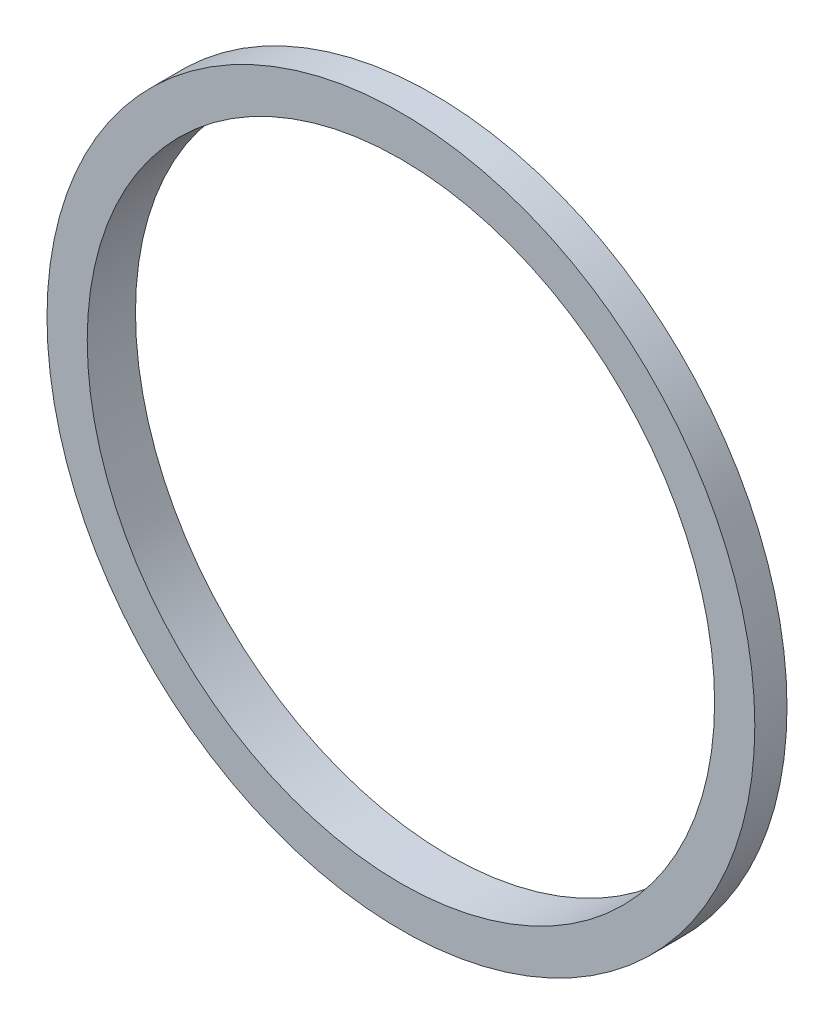
ISO-10303-21;
HEADER;
FILE_DESCRIPTION(('STEP AP214'),'2;1');
FILE_NAME('part.step','',(''),(''),'','','');
FILE_SCHEMA(('AUTOMOTIVE_DESIGN { 1 0 10303 214 1 1 1 1 }'));
ENDSEC;
DATA;
#1=APPLICATION_CONTEXT('core data for automotive mechanical design processes');
#2=APPLICATION_PROTOCOL_DEFINITION('international standard','automotive_design',2000,#1);
#3=PRODUCT_CONTEXT('',#1,'mechanical');
#4=PRODUCT('Part','Part','',(#3));
#5=PRODUCT_RELATED_PRODUCT_CATEGORY('part','',(#4));
#6=PRODUCT_DEFINITION_FORMATION('','',#4);
#7=PRODUCT_DEFINITION_CONTEXT('part definition',#1,'design');
#8=PRODUCT_DEFINITION('design','',#6,#7);
#9=PRODUCT_DEFINITION_SHAPE('','',#8);
#10=(LENGTH_UNIT() NAMED_UNIT(*) SI_UNIT(.MILLI.,.METRE.));
#11=(NAMED_UNIT(*) PLANE_ANGLE_UNIT() SI_UNIT($,.RADIAN.));
#12=(NAMED_UNIT(*) SI_UNIT($,.STERADIAN.) SOLID_ANGLE_UNIT());
#13=UNCERTAINTY_MEASURE_WITH_UNIT(LENGTH_MEASURE(1.E-05),#10,'distance_accuracy_value','');
#14=(GEOMETRIC_REPRESENTATION_CONTEXT(3) GLOBAL_UNCERTAINTY_ASSIGNED_CONTEXT((#13)) GLOBAL_UNIT_ASSIGNED_CONTEXT((#10,
#11,#12)) REPRESENTATION_CONTEXT('',''));
#15=CARTESIAN_POINT('',(0.,0.,0.));
#16=DIRECTION('',(0.,0.,1.));
#17=DIRECTION('',(1.,0.,0.));
#18=AXIS2_PLACEMENT_3D('',#15,#16,#17);
#19=CARTESIAN_POINT('',(0.,0.,2.));
#20=DIRECTION('',(0.,0.,-1.));
#21=DIRECTION('',(-1.,0.,0.));
#22=AXIS2_PLACEMENT_3D('',#19,#20,#21);
#23=CYLINDRICAL_SURFACE('',#22,22.);
#24=CARTESIAN_POINT('',(0.,0.,2.));
#25=DIRECTION('',(0.,0.,1.));
#26=DIRECTION('',(1.,0.,0.));
#27=AXIS2_PLACEMENT_3D('',#24,#25,#26);
#28=CIRCLE('',#27,22.);
#29=CARTESIAN_POINT('',(22.,0.,2.));
#30=VERTEX_POINT('',#29);
#31=EDGE_CURVE('E51',#30,#30,#28,.T.);
#32=ORIENTED_EDGE('',*,*,#31,.F.);
#33=EDGE_LOOP('',(#32));
#34=FACE_BOUND('',#33,.T.);
#35=CARTESIAN_POINT('',(0.,0.,0.));
#36=DIRECTION('',(0.,0.,1.));
#37=DIRECTION('',(1.,0.,0.));
#38=AXIS2_PLACEMENT_3D('',#35,#36,#37);
#39=CIRCLE('',#38,22.);
#40=CARTESIAN_POINT('',(22.,0.,0.));
#41=VERTEX_POINT('',#40);
#42=EDGE_CURVE('E46',#41,#41,#39,.T.);
#43=ORIENTED_EDGE('',*,*,#42,.T.);
#44=EDGE_LOOP('',(#43));
#45=FACE_BOUND('',#44,.T.);
#46=ADVANCED_FACE('F43',(#34,#45),#23,.T.);
#47=CARTESIAN_POINT('',(0.,0.,2.));
#48=DIRECTION('',(0.,0.,1.));
#49=DIRECTION('',(1.,0.,0.));
#50=AXIS2_PLACEMENT_3D('',#47,#48,#49);
#51=PLANE('',#50);
#52=CARTESIAN_POINT('',(0.,0.,2.));
#53=DIRECTION('',(0.,0.,-1.));
#54=DIRECTION('',(-1.,0.,0.));
#55=AXIS2_PLACEMENT_3D('',#52,#53,#54);
#56=CIRCLE('',#55,19.5);
#57=CARTESIAN_POINT('',(-19.5,0.,2.));
#58=VERTEX_POINT('',#57);
#59=EDGE_CURVE('E62',#58,#58,#56,.T.);
#60=ORIENTED_EDGE('',*,*,#59,.T.);
#61=EDGE_LOOP('',(#60));
#62=FACE_BOUND('',#61,.T.);
#63=ORIENTED_EDGE('',*,*,#31,.T.);
#64=EDGE_LOOP('',(#63));
#65=FACE_BOUND('',#64,.T.);
#66=ADVANCED_FACE('F71',(#62,#65),#51,.T.);
#67=CARTESIAN_POINT('',(0.,0.,0.));
#68=DIRECTION('',(0.,0.,1.));
#69=DIRECTION('',(1.,0.,0.));
#70=AXIS2_PLACEMENT_3D('',#67,#68,#69);
#71=PLANE('',#70);
#72=CARTESIAN_POINT('',(0.,0.,0.));
#73=DIRECTION('',(0.,0.,-1.));
#74=DIRECTION('',(-1.,0.,0.));
#75=AXIS2_PLACEMENT_3D('',#72,#73,#74);
#76=CIRCLE('',#75,20.5);
#77=CARTESIAN_POINT('',(-20.5,0.,0.));
#78=VERTEX_POINT('',#77);
#79=EDGE_CURVE('E10',#78,#78,#76,.T.);
#80=ORIENTED_EDGE('',*,*,#79,.F.);
#81=EDGE_LOOP('',(#80));
#82=FACE_BOUND('',#81,.T.);
#83=ORIENTED_EDGE('',*,*,#42,.F.);
#84=EDGE_LOOP('',(#83));
#85=FACE_BOUND('',#84,.T.);
#86=ADVANCED_FACE('F88',(#82,#85),#71,.F.);
#87=CARTESIAN_POINT('',(0.,0.,-1.));
#88=DIRECTION('',(0.,0.,1.));
#89=DIRECTION('',(1.,0.,0.));
#90=AXIS2_PLACEMENT_3D('',#87,#88,#89);
#91=CYLINDRICAL_SURFACE('',#90,20.5);
#92=CARTESIAN_POINT('',(0.,0.,-1.));
#93=DIRECTION('',(0.,0.,-1.));
#94=DIRECTION('',(-1.,0.,0.));
#95=AXIS2_PLACEMENT_3D('',#92,#93,#94);
#96=CIRCLE('',#95,20.5);
#97=CARTESIAN_POINT('',(-20.5,0.,-1.));
#98=VERTEX_POINT('',#97);
#99=EDGE_CURVE('E58',#98,#98,#96,.T.);
#100=ORIENTED_EDGE('',*,*,#99,.F.);
#101=EDGE_LOOP('',(#100));
#102=FACE_BOUND('',#101,.T.);
#103=ORIENTED_EDGE('',*,*,#79,.T.);
#104=EDGE_LOOP('',(#103));
#105=FACE_BOUND('',#104,.T.);
#106=ADVANCED_FACE('F83',(#102,#105),#91,.T.);
#107=CARTESIAN_POINT('',(0.,0.,-1.));
#108=DIRECTION('',(0.,0.,-1.));
#109=DIRECTION('',(-1.,0.,0.));
#110=AXIS2_PLACEMENT_3D('',#107,#108,#109);
#111=PLANE('',#110);
#112=CARTESIAN_POINT('',(0.,0.,-1.));
#113=DIRECTION('',(0.,0.,-1.));
#114=DIRECTION('',(-1.,0.,0.));
#115=AXIS2_PLACEMENT_3D('',#112,#113,#114);
#116=CIRCLE('',#115,19.5);
#117=CARTESIAN_POINT('',(-19.5,0.,-1.));
#118=VERTEX_POINT('',#117);
#119=EDGE_CURVE('E63',#118,#118,#116,.T.);
#120=ORIENTED_EDGE('',*,*,#119,.F.);
#121=EDGE_LOOP('',(#120));
#122=FACE_BOUND('',#121,.T.);
#123=ORIENTED_EDGE('',*,*,#99,.T.);
#124=EDGE_LOOP('',(#123));
#125=FACE_BOUND('',#124,.T.);
#126=ADVANCED_FACE('F77',(#122,#125),#111,.T.);
#127=CARTESIAN_POINT('',(0.,0.,2.));
#128=DIRECTION('',(0.,0.,-1.));
#129=DIRECTION('',(-1.,0.,0.));
#130=AXIS2_PLACEMENT_3D('',#127,#128,#129);
#131=CYLINDRICAL_SURFACE('',#130,19.5);
#132=ORIENTED_EDGE('',*,*,#59,.F.);
#133=EDGE_LOOP('',(#132));
#134=FACE_BOUND('',#133,.T.);
#135=ORIENTED_EDGE('',*,*,#119,.T.);
#136=EDGE_LOOP('',(#135));
#137=FACE_BOUND('',#136,.T.);
#138=ADVANCED_FACE('F74',(#134,#137),#131,.F.);
#139=CLOSED_SHELL('',(#46,#66,#86,#106,#126,#138));
#140=MANIFOLD_SOLID_BREP('B2',#139);
#141=ADVANCED_BREP_SHAPE_REPRESENTATION('',(#18,#140),#14);
#142=SHAPE_DEFINITION_REPRESENTATION(#9,#141);
ENDSEC;
END-ISO-10303-21;
